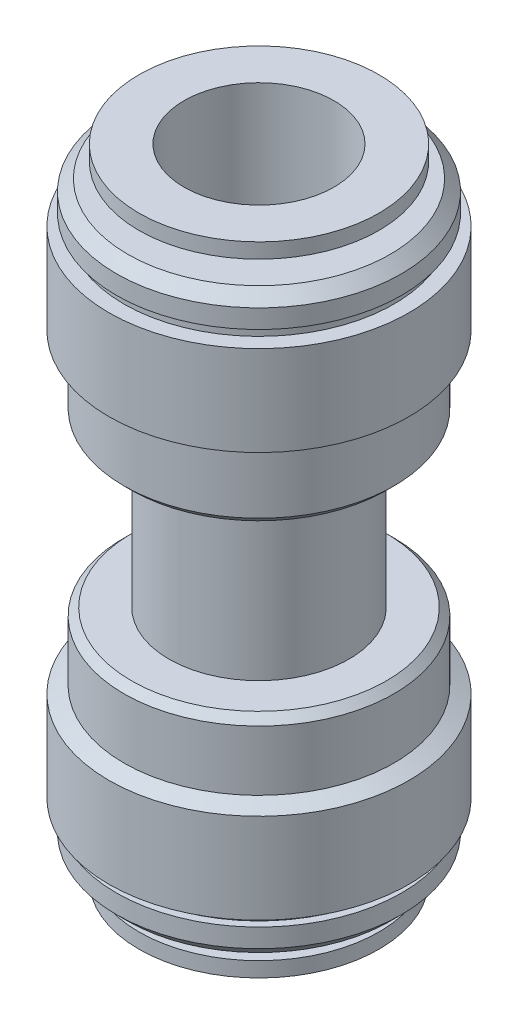
ISO-10303-21;
HEADER;
FILE_DESCRIPTION(('STEP AP214'),'2;1');
FILE_NAME('part.step','',(''),(''),'','','');
FILE_SCHEMA(('AUTOMOTIVE_DESIGN { 1 0 10303 214 1 1 1 1 }'));
ENDSEC;
DATA;
#1=APPLICATION_CONTEXT('core data for automotive mechanical design processes');
#2=APPLICATION_PROTOCOL_DEFINITION('international standard','automotive_design',2000,#1);
#3=PRODUCT_CONTEXT('',#1,'mechanical');
#4=PRODUCT('Part','Part','',(#3));
#5=PRODUCT_RELATED_PRODUCT_CATEGORY('part','',(#4));
#6=PRODUCT_DEFINITION_FORMATION('','',#4);
#7=PRODUCT_DEFINITION_CONTEXT('part definition',#1,'design');
#8=PRODUCT_DEFINITION('design','',#6,#7);
#9=PRODUCT_DEFINITION_SHAPE('','',#8);
#10=(LENGTH_UNIT() NAMED_UNIT(*) SI_UNIT(.MILLI.,.METRE.));
#11=(NAMED_UNIT(*) PLANE_ANGLE_UNIT() SI_UNIT($,.RADIAN.));
#12=(NAMED_UNIT(*) SI_UNIT($,.STERADIAN.) SOLID_ANGLE_UNIT());
#13=UNCERTAINTY_MEASURE_WITH_UNIT(LENGTH_MEASURE(1.E-05),#10,'distance_accuracy_value','');
#14=(GEOMETRIC_REPRESENTATION_CONTEXT(3) GLOBAL_UNCERTAINTY_ASSIGNED_CONTEXT((#13)) GLOBAL_UNIT_ASSIGNED_CONTEXT((#10,
#11,#12)) REPRESENTATION_CONTEXT('',''));
#15=CARTESIAN_POINT('',(0.,0.,0.));
#16=DIRECTION('',(0.,0.,1.));
#17=DIRECTION('',(1.,0.,0.));
#18=AXIS2_PLACEMENT_3D('',#15,#16,#17);
#19=CARTESIAN_POINT('',(0.,42.5,0.));
#20=DIRECTION('',(0.,-1.,0.));
#21=DIRECTION('',(0.,0.,-1.));
#22=AXIS2_PLACEMENT_3D('',#19,#20,#21);
#23=PLANE('',#22);
#24=CARTESIAN_POINT('',(0.,42.5,0.));
#25=DIRECTION('',(0.,1.,0.));
#26=DIRECTION('',(0.,0.,1.));
#27=AXIS2_PLACEMENT_3D('',#24,#25,#26);
#28=CIRCLE('',#27,5.);
#29=CARTESIAN_POINT('',(0.,42.5,5.));
#30=VERTEX_POINT('',#29);
#31=EDGE_CURVE('E129',#30,#30,#28,.T.);
#32=ORIENTED_EDGE('',*,*,#31,.F.);
#33=EDGE_LOOP('',(#32));
#34=FACE_BOUND('',#33,.T.);
#35=CARTESIAN_POINT('',(0.,42.5,0.));
#36=DIRECTION('',(0.,1.,0.));
#37=DIRECTION('',(0.,0.,1.));
#38=AXIS2_PLACEMENT_3D('',#35,#36,#37);
#39=CIRCLE('',#38,8.);
#40=CARTESIAN_POINT('',(0.,42.5,8.));
#41=VERTEX_POINT('',#40);
#42=EDGE_CURVE('E10',#41,#41,#39,.T.);
#43=ORIENTED_EDGE('',*,*,#42,.T.);
#44=EDGE_LOOP('',(#43));
#45=FACE_BOUND('',#44,.T.);
#46=ADVANCED_FACE('F32',(#34,#45),#23,.F.);
#47=CARTESIAN_POINT('',(0.,136.374036199003,0.));
#48=DIRECTION('',(0.,1.,0.));
#49=DIRECTION('',(0.,0.,1.));
#50=AXIS2_PLACEMENT_3D('',#47,#48,#49);
#51=CYLINDRICAL_SURFACE('',#50,8.);
#52=ORIENTED_EDGE('',*,*,#42,.F.);
#53=EDGE_LOOP('',(#52));
#54=FACE_BOUND('',#53,.T.);
#55=CARTESIAN_POINT('',(0.,41.5,0.));
#56=DIRECTION('',(0.,1.,0.));
#57=DIRECTION('',(0.,0.,1.));
#58=AXIS2_PLACEMENT_3D('',#55,#56,#57);
#59=CIRCLE('',#58,8.);
#60=CARTESIAN_POINT('',(0.,41.5,8.));
#61=VERTEX_POINT('',#60);
#62=EDGE_CURVE('E39',#61,#61,#59,.T.);
#63=ORIENTED_EDGE('',*,*,#62,.T.);
#64=EDGE_LOOP('',(#63));
#65=FACE_BOUND('',#64,.T.);
#66=ADVANCED_FACE('F148',(#54,#65),#51,.T.);
#67=CARTESIAN_POINT('',(8.,41.5,0.));
#68=DIRECTION('',(0.,1.,0.));
#69=DIRECTION('',(0.,0.,1.));
#70=AXIS2_PLACEMENT_3D('',#67,#68,#69);
#71=PLANE('',#70);
#72=ORIENTED_EDGE('',*,*,#62,.F.);
#73=EDGE_LOOP('',(#72));
#74=FACE_BOUND('',#73,.T.);
#75=CARTESIAN_POINT('',(0.,41.5,0.));
#76=DIRECTION('',(0.,1.,0.));
#77=DIRECTION('',(0.,0.,1.));
#78=AXIS2_PLACEMENT_3D('',#75,#76,#77);
#79=CIRCLE('',#78,6.);
#80=CARTESIAN_POINT('',(0.,41.5,6.));
#81=VERTEX_POINT('',#80);
#82=EDGE_CURVE('E43',#81,#81,#79,.T.);
#83=ORIENTED_EDGE('',*,*,#82,.T.);
#84=EDGE_LOOP('',(#83));
#85=FACE_BOUND('',#84,.T.);
#86=ADVANCED_FACE('F153',(#74,#85),#71,.F.);
#87=CARTESIAN_POINT('',(0.,136.374036199003,0.));
#88=DIRECTION('',(0.,1.,0.));
#89=DIRECTION('',(0.,0.,1.));
#90=AXIS2_PLACEMENT_3D('',#87,#88,#89);
#91=CYLINDRICAL_SURFACE('',#90,6.);
#92=ORIENTED_EDGE('',*,*,#82,.F.);
#93=EDGE_LOOP('',(#92));
#94=FACE_BOUND('',#93,.T.);
#95=CARTESIAN_POINT('',(0.,40.5,0.));
#96=DIRECTION('',(0.,1.,0.));
#97=DIRECTION('',(0.,0.,1.));
#98=AXIS2_PLACEMENT_3D('',#95,#96,#97);
#99=CIRCLE('',#98,6.);
#100=CARTESIAN_POINT('',(0.,40.5,6.));
#101=VERTEX_POINT('',#100);
#102=EDGE_CURVE('E48',#101,#101,#99,.T.);
#103=ORIENTED_EDGE('',*,*,#102,.T.);
#104=EDGE_LOOP('',(#103));
#105=FACE_BOUND('',#104,.T.);
#106=ADVANCED_FACE('F158',(#94,#105),#91,.T.);
#107=CARTESIAN_POINT('',(6.,40.5,0.));
#108=DIRECTION('',(0.,-1.,0.));
#109=DIRECTION('',(0.,0.,-1.));
#110=AXIS2_PLACEMENT_3D('',#107,#108,#109);
#111=PLANE('',#110);
#112=ORIENTED_EDGE('',*,*,#102,.F.);
#113=EDGE_LOOP('',(#112));
#114=FACE_BOUND('',#113,.T.);
#115=CARTESIAN_POINT('',(0.,40.5,0.));
#116=DIRECTION('',(0.,1.,0.));
#117=DIRECTION('',(0.,0.,1.));
#118=AXIS2_PLACEMENT_3D('',#115,#116,#117);
#119=CIRCLE('',#118,8.75000000000001);
#120=CARTESIAN_POINT('',(0.,40.5,8.75000000000001));
#121=VERTEX_POINT('',#120);
#122=EDGE_CURVE('E51',#121,#121,#119,.T.);
#123=ORIENTED_EDGE('',*,*,#122,.T.);
#124=EDGE_LOOP('',(#123));
#125=FACE_BOUND('',#124,.T.);
#126=ADVANCED_FACE('F165',(#114,#125),#111,.F.);
#127=CARTESIAN_POINT('',(0.,39.75,0.));
#128=DIRECTION('',(0.,-1.,0.));
#129=DIRECTION('',(0.,0.,-1.));
#130=AXIS2_PLACEMENT_3D('',#127,#128,#129);
#131=CONICAL_SURFACE('',#130,9.50000000000002,0.785398163397448);
#132=ORIENTED_EDGE('',*,*,#122,.F.);
#133=EDGE_LOOP('',(#132));
#134=FACE_BOUND('',#133,.T.);
#135=CARTESIAN_POINT('',(0.,39.75,0.));
#136=DIRECTION('',(0.,1.,0.));
#137=DIRECTION('',(0.,0.,1.));
#138=AXIS2_PLACEMENT_3D('',#135,#136,#137);
#139=CIRCLE('',#138,9.50000000000002);
#140=CARTESIAN_POINT('',(0.,39.75,9.50000000000002));
#141=VERTEX_POINT('',#140);
#142=EDGE_CURVE('E54',#141,#141,#139,.T.);
#143=ORIENTED_EDGE('',*,*,#142,.T.);
#144=EDGE_LOOP('',(#143));
#145=FACE_BOUND('',#144,.T.);
#146=ADVANCED_FACE('F169',(#134,#145),#131,.T.);
#147=CARTESIAN_POINT('',(0.,136.374036199003,0.));
#148=DIRECTION('',(0.,1.,0.));
#149=DIRECTION('',(0.,0.,1.));
#150=AXIS2_PLACEMENT_3D('',#147,#148,#149);
#151=CYLINDRICAL_SURFACE('',#150,9.50000000000002);
#152=ORIENTED_EDGE('',*,*,#142,.F.);
#153=EDGE_LOOP('',(#152));
#154=FACE_BOUND('',#153,.T.);
#155=CARTESIAN_POINT('',(0.,38.5,0.));
#156=DIRECTION('',(0.,1.,0.));
#157=DIRECTION('',(0.,0.,1.));
#158=AXIS2_PLACEMENT_3D('',#155,#156,#157);
#159=CIRCLE('',#158,9.50000000000002);
#160=CARTESIAN_POINT('',(0.,38.5,9.50000000000002));
#161=VERTEX_POINT('',#160);
#162=EDGE_CURVE('E57',#161,#161,#159,.T.);
#163=ORIENTED_EDGE('',*,*,#162,.T.);
#164=EDGE_LOOP('',(#163));
#165=FACE_BOUND('',#164,.T.);
#166=ADVANCED_FACE('F173',(#154,#165),#151,.T.);
#167=CARTESIAN_POINT('',(9.50000000000002,38.5,0.));
#168=DIRECTION('',(0.,1.,0.));
#169=DIRECTION('',(0.,0.,1.));
#170=AXIS2_PLACEMENT_3D('',#167,#168,#169);
#171=PLANE('',#170);
#172=ORIENTED_EDGE('',*,*,#162,.F.);
#173=EDGE_LOOP('',(#172));
#174=FACE_BOUND('',#173,.T.);
#175=CARTESIAN_POINT('',(0.,38.5,0.));
#176=DIRECTION('',(0.,1.,0.));
#177=DIRECTION('',(0.,0.,1.));
#178=AXIS2_PLACEMENT_3D('',#175,#176,#177);
#179=CIRCLE('',#178,9.00000000000001);
#180=CARTESIAN_POINT('',(0.,38.5,9.00000000000001));
#181=VERTEX_POINT('',#180);
#182=EDGE_CURVE('E60',#181,#181,#179,.T.);
#183=ORIENTED_EDGE('',*,*,#182,.T.);
#184=EDGE_LOOP('',(#183));
#185=FACE_BOUND('',#184,.T.);
#186=ADVANCED_FACE('F177',(#174,#185),#171,.F.);
#187=CARTESIAN_POINT('',(0.,136.374036199003,0.));
#188=DIRECTION('',(0.,1.,0.));
#189=DIRECTION('',(0.,0.,1.));
#190=AXIS2_PLACEMENT_3D('',#187,#188,#189);
#191=CYLINDRICAL_SURFACE('',#190,9.00000000000001);
#192=ORIENTED_EDGE('',*,*,#182,.F.);
#193=EDGE_LOOP('',(#192));
#194=FACE_BOUND('',#193,.T.);
#195=CARTESIAN_POINT('',(0.,37.75,0.));
#196=DIRECTION('',(0.,1.,0.));
#197=DIRECTION('',(0.,0.,1.));
#198=AXIS2_PLACEMENT_3D('',#195,#196,#197);
#199=CIRCLE('',#198,9.00000000000001);
#200=CARTESIAN_POINT('',(0.,37.75,9.00000000000001));
#201=VERTEX_POINT('',#200);
#202=EDGE_CURVE('E63',#201,#201,#199,.T.);
#203=ORIENTED_EDGE('',*,*,#202,.T.);
#204=EDGE_LOOP('',(#203));
#205=FACE_BOUND('',#204,.T.);
#206=ADVANCED_FACE('F181',(#194,#205),#191,.T.);
#207=CARTESIAN_POINT('',(9.00000000000001,37.75,0.));
#208=DIRECTION('',(0.,-1.,0.));
#209=DIRECTION('',(0.,0.,-1.));
#210=AXIS2_PLACEMENT_3D('',#207,#208,#209);
#211=PLANE('',#210);
#212=ORIENTED_EDGE('',*,*,#202,.F.);
#213=EDGE_LOOP('',(#212));
#214=FACE_BOUND('',#213,.T.);
#215=CARTESIAN_POINT('',(0.,37.75,0.));
#216=DIRECTION('',(0.,1.,0.));
#217=DIRECTION('',(0.,0.,1.));
#218=AXIS2_PLACEMENT_3D('',#215,#216,#217);
#219=CIRCLE('',#218,10.);
#220=CARTESIAN_POINT('',(0.,37.75,10.));
#221=VERTEX_POINT('',#220);
#222=EDGE_CURVE('E66',#221,#221,#219,.T.);
#223=ORIENTED_EDGE('',*,*,#222,.T.);
#224=EDGE_LOOP('',(#223));
#225=FACE_BOUND('',#224,.T.);
#226=ADVANCED_FACE('F185',(#214,#225),#211,.F.);
#227=CARTESIAN_POINT('',(0.,136.374036199003,0.));
#228=DIRECTION('',(0.,1.,0.));
#229=DIRECTION('',(0.,0.,1.));
#230=AXIS2_PLACEMENT_3D('',#227,#228,#229);
#231=CYLINDRICAL_SURFACE('',#230,10.);
#232=ORIENTED_EDGE('',*,*,#222,.F.);
#233=EDGE_LOOP('',(#232));
#234=FACE_BOUND('',#233,.T.);
#235=CARTESIAN_POINT('',(0.,31.75,0.));
#236=DIRECTION('',(0.,1.,0.));
#237=DIRECTION('',(0.,0.,1.));
#238=AXIS2_PLACEMENT_3D('',#235,#236,#237);
#239=CIRCLE('',#238,10.);
#240=CARTESIAN_POINT('',(0.,31.75,10.));
#241=VERTEX_POINT('',#240);
#242=EDGE_CURVE('E69',#241,#241,#239,.T.);
#243=ORIENTED_EDGE('',*,*,#242,.T.);
#244=EDGE_LOOP('',(#243));
#245=FACE_BOUND('',#244,.T.);
#246=ADVANCED_FACE('F189',(#234,#245),#231,.T.);
#247=CARTESIAN_POINT('',(0.,31.25,0.));
#248=DIRECTION('',(0.,1.,0.));
#249=DIRECTION('',(0.,0.,1.));
#250=AXIS2_PLACEMENT_3D('',#247,#248,#249);
#251=CONICAL_SURFACE('',#250,9.00000000000001,1.10714871779409);
#252=ORIENTED_EDGE('',*,*,#242,.F.);
#253=EDGE_LOOP('',(#252));
#254=FACE_BOUND('',#253,.T.);
#255=CARTESIAN_POINT('',(0.,31.25,0.));
#256=DIRECTION('',(0.,1.,0.));
#257=DIRECTION('',(0.,0.,1.));
#258=AXIS2_PLACEMENT_3D('',#255,#256,#257);
#259=CIRCLE('',#258,9.00000000000001);
#260=CARTESIAN_POINT('',(0.,31.25,9.00000000000001));
#261=VERTEX_POINT('',#260);
#262=EDGE_CURVE('E72',#261,#261,#259,.T.);
#263=ORIENTED_EDGE('',*,*,#262,.T.);
#264=EDGE_LOOP('',(#263));
#265=FACE_BOUND('',#264,.T.);
#266=ADVANCED_FACE('F193',(#254,#265),#251,.T.);
#267=CARTESIAN_POINT('',(0.,136.374036199003,0.));
#268=DIRECTION('',(0.,1.,0.));
#269=DIRECTION('',(0.,0.,1.));
#270=AXIS2_PLACEMENT_3D('',#267,#268,#269);
#271=CYLINDRICAL_SURFACE('',#270,9.00000000000001);
#272=ORIENTED_EDGE('',*,*,#262,.F.);
#273=EDGE_LOOP('',(#272));
#274=FACE_BOUND('',#273,.T.);
#275=CARTESIAN_POINT('',(0.,27.25,0.));
#276=DIRECTION('',(0.,1.,0.));
#277=DIRECTION('',(0.,0.,1.));
#278=AXIS2_PLACEMENT_3D('',#275,#276,#277);
#279=CIRCLE('',#278,9.00000000000001);
#280=CARTESIAN_POINT('',(0.,27.25,9.00000000000001));
#281=VERTEX_POINT('',#280);
#282=EDGE_CURVE('E75',#281,#281,#279,.T.);
#283=ORIENTED_EDGE('',*,*,#282,.T.);
#284=EDGE_LOOP('',(#283));
#285=FACE_BOUND('',#284,.T.);
#286=ADVANCED_FACE('F197',(#274,#285),#271,.T.);
#287=CARTESIAN_POINT('',(0.,26.75,0.));
#288=DIRECTION('',(0.,1.,0.));
#289=DIRECTION('',(0.,0.,1.));
#290=AXIS2_PLACEMENT_3D('',#287,#288,#289);
#291=CONICAL_SURFACE('',#290,8.50000000000001,0.785398163397448);
#292=ORIENTED_EDGE('',*,*,#282,.F.);
#293=EDGE_LOOP('',(#292));
#294=FACE_BOUND('',#293,.T.);
#295=CARTESIAN_POINT('',(0.,26.75,0.));
#296=DIRECTION('',(0.,1.,0.));
#297=DIRECTION('',(0.,0.,1.));
#298=AXIS2_PLACEMENT_3D('',#295,#296,#297);
#299=CIRCLE('',#298,8.50000000000001);
#300=CARTESIAN_POINT('',(0.,26.75,8.50000000000001));
#301=VERTEX_POINT('',#300);
#302=EDGE_CURVE('E78',#301,#301,#299,.T.);
#303=ORIENTED_EDGE('',*,*,#302,.T.);
#304=EDGE_LOOP('',(#303));
#305=FACE_BOUND('',#304,.T.);
#306=ADVANCED_FACE('F201',(#294,#305),#291,.T.);
#307=CARTESIAN_POINT('',(8.50000000000001,26.75,0.));
#308=DIRECTION('',(0.,1.,0.));
#309=DIRECTION('',(0.,0.,1.));
#310=AXIS2_PLACEMENT_3D('',#307,#308,#309);
#311=PLANE('',#310);
#312=ORIENTED_EDGE('',*,*,#302,.F.);
#313=EDGE_LOOP('',(#312));
#314=FACE_BOUND('',#313,.T.);
#315=CARTESIAN_POINT('',(0.,26.75,0.));
#316=DIRECTION('',(0.,1.,0.));
#317=DIRECTION('',(0.,0.,1.));
#318=AXIS2_PLACEMENT_3D('',#315,#316,#317);
#319=CIRCLE('',#318,6.00000000000002);
#320=CARTESIAN_POINT('',(0.,26.75,6.00000000000002));
#321=VERTEX_POINT('',#320);
#322=EDGE_CURVE('E81',#321,#321,#319,.T.);
#323=ORIENTED_EDGE('',*,*,#322,.T.);
#324=EDGE_LOOP('',(#323));
#325=FACE_BOUND('',#324,.T.);
#326=ADVANCED_FACE('F205',(#314,#325),#311,.F.);
#327=CARTESIAN_POINT('',(0.,136.374036199003,0.));
#328=DIRECTION('',(0.,1.,0.));
#329=DIRECTION('',(0.,0.,1.));
#330=AXIS2_PLACEMENT_3D('',#327,#328,#329);
#331=CYLINDRICAL_SURFACE('',#330,6.00000000000002);
#332=ORIENTED_EDGE('',*,*,#322,.F.);
#333=EDGE_LOOP('',(#332));
#334=FACE_BOUND('',#333,.T.);
#335=CARTESIAN_POINT('',(0.,15.75,0.));
#336=DIRECTION('',(0.,1.,0.));
#337=DIRECTION('',(0.,0.,1.));
#338=AXIS2_PLACEMENT_3D('',#335,#336,#337);
#339=CIRCLE('',#338,6.00000000000002);
#340=CARTESIAN_POINT('',(0.,15.75,6.00000000000002));
#341=VERTEX_POINT('',#340);
#342=EDGE_CURVE('E84',#341,#341,#339,.T.);
#343=ORIENTED_EDGE('',*,*,#342,.T.);
#344=EDGE_LOOP('',(#343));
#345=FACE_BOUND('',#344,.T.);
#346=ADVANCED_FACE('F209',(#334,#345),#331,.T.);
#347=CARTESIAN_POINT('',(8.50000000000001,15.75,0.));
#348=DIRECTION('',(0.,-1.,0.));
#349=DIRECTION('',(0.,0.,-1.));
#350=AXIS2_PLACEMENT_3D('',#347,#348,#349);
#351=PLANE('',#350);
#352=ORIENTED_EDGE('',*,*,#342,.F.);
#353=EDGE_LOOP('',(#352));
#354=FACE_BOUND('',#353,.T.);
#355=CARTESIAN_POINT('',(0.,15.75,0.));
#356=DIRECTION('',(0.,1.,0.));
#357=DIRECTION('',(0.,0.,1.));
#358=AXIS2_PLACEMENT_3D('',#355,#356,#357);
#359=CIRCLE('',#358,8.50000000000001);
#360=CARTESIAN_POINT('',(0.,15.75,8.50000000000001));
#361=VERTEX_POINT('',#360);
#362=EDGE_CURVE('E87',#361,#361,#359,.T.);
#363=ORIENTED_EDGE('',*,*,#362,.T.);
#364=EDGE_LOOP('',(#363));
#365=FACE_BOUND('',#364,.T.);
#366=ADVANCED_FACE('F213',(#354,#365),#351,.F.);
#367=CARTESIAN_POINT('',(0.,15.25,0.));
#368=DIRECTION('',(0.,-1.,0.));
#369=DIRECTION('',(0.,0.,-1.));
#370=AXIS2_PLACEMENT_3D('',#367,#368,#369);
#371=CONICAL_SURFACE('',#370,9.00000000000001,0.785398163397448);
#372=ORIENTED_EDGE('',*,*,#362,.F.);
#373=EDGE_LOOP('',(#372));
#374=FACE_BOUND('',#373,.T.);
#375=CARTESIAN_POINT('',(0.,15.25,0.));
#376=DIRECTION('',(0.,1.,0.));
#377=DIRECTION('',(0.,0.,1.));
#378=AXIS2_PLACEMENT_3D('',#375,#376,#377);
#379=CIRCLE('',#378,9.00000000000001);
#380=CARTESIAN_POINT('',(0.,15.25,9.00000000000001));
#381=VERTEX_POINT('',#380);
#382=EDGE_CURVE('E90',#381,#381,#379,.T.);
#383=ORIENTED_EDGE('',*,*,#382,.T.);
#384=EDGE_LOOP('',(#383));
#385=FACE_BOUND('',#384,.T.);
#386=ADVANCED_FACE('F217',(#374,#385),#371,.T.);
#387=CARTESIAN_POINT('',(0.,136.374036199003,0.));
#388=DIRECTION('',(0.,1.,0.));
#389=DIRECTION('',(0.,0.,1.));
#390=AXIS2_PLACEMENT_3D('',#387,#388,#389);
#391=CYLINDRICAL_SURFACE('',#390,9.00000000000001);
#392=ORIENTED_EDGE('',*,*,#382,.F.);
#393=EDGE_LOOP('',(#392));
#394=FACE_BOUND('',#393,.T.);
#395=CARTESIAN_POINT('',(0.,11.25,0.));
#396=DIRECTION('',(0.,1.,0.));
#397=DIRECTION('',(0.,0.,1.));
#398=AXIS2_PLACEMENT_3D('',#395,#396,#397);
#399=CIRCLE('',#398,9.00000000000001);
#400=CARTESIAN_POINT('',(0.,11.25,9.00000000000001));
#401=VERTEX_POINT('',#400);
#402=EDGE_CURVE('E93',#401,#401,#399,.T.);
#403=ORIENTED_EDGE('',*,*,#402,.T.);
#404=EDGE_LOOP('',(#403));
#405=FACE_BOUND('',#404,.T.);
#406=ADVANCED_FACE('F221',(#394,#405),#391,.T.);
#407=CARTESIAN_POINT('',(0.,10.75,0.));
#408=DIRECTION('',(0.,-1.,0.));
#409=DIRECTION('',(0.,0.,-1.));
#410=AXIS2_PLACEMENT_3D('',#407,#408,#409);
#411=CONICAL_SURFACE('',#410,10.,1.10714871779409);
#412=ORIENTED_EDGE('',*,*,#402,.F.);
#413=EDGE_LOOP('',(#412));
#414=FACE_BOUND('',#413,.T.);
#415=CARTESIAN_POINT('',(0.,10.75,0.));
#416=DIRECTION('',(0.,1.,0.));
#417=DIRECTION('',(0.,0.,1.));
#418=AXIS2_PLACEMENT_3D('',#415,#416,#417);
#419=CIRCLE('',#418,10.);
#420=CARTESIAN_POINT('',(0.,10.75,10.));
#421=VERTEX_POINT('',#420);
#422=EDGE_CURVE('E96',#421,#421,#419,.T.);
#423=ORIENTED_EDGE('',*,*,#422,.T.);
#424=EDGE_LOOP('',(#423));
#425=FACE_BOUND('',#424,.T.);
#426=ADVANCED_FACE('F225',(#414,#425),#411,.T.);
#427=CARTESIAN_POINT('',(0.,136.374036199003,0.));
#428=DIRECTION('',(0.,1.,0.));
#429=DIRECTION('',(0.,0.,1.));
#430=AXIS2_PLACEMENT_3D('',#427,#428,#429);
#431=CYLINDRICAL_SURFACE('',#430,10.);
#432=ORIENTED_EDGE('',*,*,#422,.F.);
#433=EDGE_LOOP('',(#432));
#434=FACE_BOUND('',#433,.T.);
#435=CARTESIAN_POINT('',(0.,4.75,0.));
#436=DIRECTION('',(0.,1.,0.));
#437=DIRECTION('',(0.,0.,1.));
#438=AXIS2_PLACEMENT_3D('',#435,#436,#437);
#439=CIRCLE('',#438,10.);
#440=CARTESIAN_POINT('',(0.,4.75,10.));
#441=VERTEX_POINT('',#440);
#442=EDGE_CURVE('E99',#441,#441,#439,.T.);
#443=ORIENTED_EDGE('',*,*,#442,.T.);
#444=EDGE_LOOP('',(#443));
#445=FACE_BOUND('',#444,.T.);
#446=ADVANCED_FACE('F229',(#434,#445),#431,.T.);
#447=CARTESIAN_POINT('',(9.00000000000001,4.75,0.));
#448=DIRECTION('',(0.,1.,0.));
#449=DIRECTION('',(0.,0.,1.));
#450=AXIS2_PLACEMENT_3D('',#447,#448,#449);
#451=PLANE('',#450);
#452=ORIENTED_EDGE('',*,*,#442,.F.);
#453=EDGE_LOOP('',(#452));
#454=FACE_BOUND('',#453,.T.);
#455=CARTESIAN_POINT('',(0.,4.75,0.));
#456=DIRECTION('',(0.,1.,0.));
#457=DIRECTION('',(0.,0.,1.));
#458=AXIS2_PLACEMENT_3D('',#455,#456,#457);
#459=CIRCLE('',#458,9.00000000000001);
#460=CARTESIAN_POINT('',(0.,4.75,9.00000000000001));
#461=VERTEX_POINT('',#460);
#462=EDGE_CURVE('E102',#461,#461,#459,.T.);
#463=ORIENTED_EDGE('',*,*,#462,.T.);
#464=EDGE_LOOP('',(#463));
#465=FACE_BOUND('',#464,.T.);
#466=ADVANCED_FACE('F233',(#454,#465),#451,.F.);
#467=CARTESIAN_POINT('',(0.,136.374036199003,0.));
#468=DIRECTION('',(0.,1.,0.));
#469=DIRECTION('',(0.,0.,1.));
#470=AXIS2_PLACEMENT_3D('',#467,#468,#469);
#471=CYLINDRICAL_SURFACE('',#470,9.00000000000001);
#472=ORIENTED_EDGE('',*,*,#462,.F.);
#473=EDGE_LOOP('',(#472));
#474=FACE_BOUND('',#473,.T.);
#475=CARTESIAN_POINT('',(0.,4.,0.));
#476=DIRECTION('',(0.,1.,0.));
#477=DIRECTION('',(0.,0.,1.));
#478=AXIS2_PLACEMENT_3D('',#475,#476,#477);
#479=CIRCLE('',#478,9.00000000000001);
#480=CARTESIAN_POINT('',(0.,4.,9.00000000000001));
#481=VERTEX_POINT('',#480);
#482=EDGE_CURVE('E105',#481,#481,#479,.T.);
#483=ORIENTED_EDGE('',*,*,#482,.T.);
#484=EDGE_LOOP('',(#483));
#485=FACE_BOUND('',#484,.T.);
#486=ADVANCED_FACE('F237',(#474,#485),#471,.T.);
#487=CARTESIAN_POINT('',(9.50000000000002,4.,0.));
#488=DIRECTION('',(0.,-1.,0.));
#489=DIRECTION('',(0.,0.,-1.));
#490=AXIS2_PLACEMENT_3D('',#487,#488,#489);
#491=PLANE('',#490);
#492=ORIENTED_EDGE('',*,*,#482,.F.);
#493=EDGE_LOOP('',(#492));
#494=FACE_BOUND('',#493,.T.);
#495=CARTESIAN_POINT('',(0.,4.,0.));
#496=DIRECTION('',(0.,1.,0.));
#497=DIRECTION('',(0.,0.,1.));
#498=AXIS2_PLACEMENT_3D('',#495,#496,#497);
#499=CIRCLE('',#498,9.50000000000002);
#500=CARTESIAN_POINT('',(0.,4.,9.50000000000002));
#501=VERTEX_POINT('',#500);
#502=EDGE_CURVE('E108',#501,#501,#499,.T.);
#503=ORIENTED_EDGE('',*,*,#502,.T.);
#504=EDGE_LOOP('',(#503));
#505=FACE_BOUND('',#504,.T.);
#506=ADVANCED_FACE('F241',(#494,#505),#491,.F.);
#507=CARTESIAN_POINT('',(0.,136.374036199003,0.));
#508=DIRECTION('',(0.,1.,0.));
#509=DIRECTION('',(0.,0.,1.));
#510=AXIS2_PLACEMENT_3D('',#507,#508,#509);
#511=CYLINDRICAL_SURFACE('',#510,9.50000000000002);
#512=ORIENTED_EDGE('',*,*,#502,.F.);
#513=EDGE_LOOP('',(#512));
#514=FACE_BOUND('',#513,.T.);
#515=CARTESIAN_POINT('',(0.,2.75,0.));
#516=DIRECTION('',(0.,1.,0.));
#517=DIRECTION('',(0.,0.,1.));
#518=AXIS2_PLACEMENT_3D('',#515,#516,#517);
#519=CIRCLE('',#518,9.50000000000002);
#520=CARTESIAN_POINT('',(0.,2.75,9.50000000000002));
#521=VERTEX_POINT('',#520);
#522=EDGE_CURVE('E111',#521,#521,#519,.T.);
#523=ORIENTED_EDGE('',*,*,#522,.T.);
#524=EDGE_LOOP('',(#523));
#525=FACE_BOUND('',#524,.T.);
#526=ADVANCED_FACE('F245',(#514,#525),#511,.T.);
#527=CARTESIAN_POINT('',(0.,2.,0.));
#528=DIRECTION('',(0.,1.,0.));
#529=DIRECTION('',(0.,0.,1.));
#530=AXIS2_PLACEMENT_3D('',#527,#528,#529);
#531=CONICAL_SURFACE('',#530,8.75000000000001,0.785398163397448);
#532=ORIENTED_EDGE('',*,*,#522,.F.);
#533=EDGE_LOOP('',(#532));
#534=FACE_BOUND('',#533,.T.);
#535=CARTESIAN_POINT('',(0.,2.,0.));
#536=DIRECTION('',(0.,1.,0.));
#537=DIRECTION('',(0.,0.,1.));
#538=AXIS2_PLACEMENT_3D('',#535,#536,#537);
#539=CIRCLE('',#538,8.75000000000001);
#540=CARTESIAN_POINT('',(0.,2.,8.75000000000001));
#541=VERTEX_POINT('',#540);
#542=EDGE_CURVE('E114',#541,#541,#539,.T.);
#543=ORIENTED_EDGE('',*,*,#542,.T.);
#544=EDGE_LOOP('',(#543));
#545=FACE_BOUND('',#544,.T.);
#546=ADVANCED_FACE('F249',(#534,#545),#531,.T.);
#547=CARTESIAN_POINT('',(6.,2.,0.));
#548=DIRECTION('',(0.,1.,0.));
#549=DIRECTION('',(0.,0.,1.));
#550=AXIS2_PLACEMENT_3D('',#547,#548,#549);
#551=PLANE('',#550);
#552=ORIENTED_EDGE('',*,*,#542,.F.);
#553=EDGE_LOOP('',(#552));
#554=FACE_BOUND('',#553,.T.);
#555=CARTESIAN_POINT('',(0.,2.,0.));
#556=DIRECTION('',(0.,1.,0.));
#557=DIRECTION('',(0.,0.,1.));
#558=AXIS2_PLACEMENT_3D('',#555,#556,#557);
#559=CIRCLE('',#558,6.);
#560=CARTESIAN_POINT('',(0.,2.,6.));
#561=VERTEX_POINT('',#560);
#562=EDGE_CURVE('E117',#561,#561,#559,.T.);
#563=ORIENTED_EDGE('',*,*,#562,.T.);
#564=EDGE_LOOP('',(#563));
#565=FACE_BOUND('',#564,.T.);
#566=ADVANCED_FACE('F253',(#554,#565),#551,.F.);
#567=CARTESIAN_POINT('',(0.,136.374036199003,0.));
#568=DIRECTION('',(0.,1.,0.));
#569=DIRECTION('',(0.,0.,1.));
#570=AXIS2_PLACEMENT_3D('',#567,#568,#569);
#571=CYLINDRICAL_SURFACE('',#570,6.);
#572=ORIENTED_EDGE('',*,*,#562,.F.);
#573=EDGE_LOOP('',(#572));
#574=FACE_BOUND('',#573,.T.);
#575=CARTESIAN_POINT('',(0.,1.,0.));
#576=DIRECTION('',(0.,1.,0.));
#577=DIRECTION('',(0.,0.,1.));
#578=AXIS2_PLACEMENT_3D('',#575,#576,#577);
#579=CIRCLE('',#578,6.);
#580=CARTESIAN_POINT('',(0.,1.,6.));
#581=VERTEX_POINT('',#580);
#582=EDGE_CURVE('E120',#581,#581,#579,.T.);
#583=ORIENTED_EDGE('',*,*,#582,.T.);
#584=EDGE_LOOP('',(#583));
#585=FACE_BOUND('',#584,.T.);
#586=ADVANCED_FACE('F257',(#574,#585),#571,.T.);
#587=CARTESIAN_POINT('',(8.,1.,0.));
#588=DIRECTION('',(0.,-1.,0.));
#589=DIRECTION('',(0.,0.,-1.));
#590=AXIS2_PLACEMENT_3D('',#587,#588,#589);
#591=PLANE('',#590);
#592=ORIENTED_EDGE('',*,*,#582,.F.);
#593=EDGE_LOOP('',(#592));
#594=FACE_BOUND('',#593,.T.);
#595=CARTESIAN_POINT('',(0.,1.,0.));
#596=DIRECTION('',(0.,1.,0.));
#597=DIRECTION('',(0.,0.,1.));
#598=AXIS2_PLACEMENT_3D('',#595,#596,#597);
#599=CIRCLE('',#598,8.);
#600=CARTESIAN_POINT('',(0.,1.,8.));
#601=VERTEX_POINT('',#600);
#602=EDGE_CURVE('E123',#601,#601,#599,.T.);
#603=ORIENTED_EDGE('',*,*,#602,.T.);
#604=EDGE_LOOP('',(#603));
#605=FACE_BOUND('',#604,.T.);
#606=ADVANCED_FACE('F261',(#594,#605),#591,.F.);
#607=CARTESIAN_POINT('',(0.,136.374036199003,0.));
#608=DIRECTION('',(0.,1.,0.));
#609=DIRECTION('',(0.,0.,1.));
#610=AXIS2_PLACEMENT_3D('',#607,#608,#609);
#611=CYLINDRICAL_SURFACE('',#610,8.);
#612=ORIENTED_EDGE('',*,*,#602,.F.);
#613=EDGE_LOOP('',(#612));
#614=FACE_BOUND('',#613,.T.);
#615=CARTESIAN_POINT('',(0.,0.,0.));
#616=DIRECTION('',(0.,1.,0.));
#617=DIRECTION('',(0.,0.,1.));
#618=AXIS2_PLACEMENT_3D('',#615,#616,#617);
#619=CIRCLE('',#618,8.);
#620=CARTESIAN_POINT('',(0.,0.,8.));
#621=VERTEX_POINT('',#620);
#622=EDGE_CURVE('E126',#621,#621,#619,.T.);
#623=ORIENTED_EDGE('',*,*,#622,.T.);
#624=EDGE_LOOP('',(#623));
#625=FACE_BOUND('',#624,.T.);
#626=ADVANCED_FACE('F145',(#614,#625),#611,.T.);
#627=CARTESIAN_POINT('',(0.,0.,0.));
#628=DIRECTION('',(0.,1.,0.));
#629=DIRECTION('',(0.,0.,1.));
#630=AXIS2_PLACEMENT_3D('',#627,#628,#629);
#631=PLANE('',#630);
#632=CARTESIAN_POINT('',(0.,0.,0.));
#633=DIRECTION('',(0.,1.,0.));
#634=DIRECTION('',(0.,0.,1.));
#635=AXIS2_PLACEMENT_3D('',#632,#633,#634);
#636=CIRCLE('',#635,5.);
#637=CARTESIAN_POINT('',(0.,0.,5.));
#638=VERTEX_POINT('',#637);
#639=EDGE_CURVE('E35',#638,#638,#636,.T.);
#640=ORIENTED_EDGE('',*,*,#639,.T.);
#641=EDGE_LOOP('',(#640));
#642=FACE_BOUND('',#641,.T.);
#643=ORIENTED_EDGE('',*,*,#622,.F.);
#644=EDGE_LOOP('',(#643));
#645=FACE_BOUND('',#644,.T.);
#646=ADVANCED_FACE('F136',(#642,#645),#631,.F.);
#647=CARTESIAN_POINT('',(0.,-17.5,0.));
#648=DIRECTION('',(0.,1.,0.));
#649=DIRECTION('',(0.,0.,1.));
#650=AXIS2_PLACEMENT_3D('',#647,#648,#649);
#651=CYLINDRICAL_SURFACE('',#650,5.);
#652=CARTESIAN_POINT('',(0.,42.5,5.));
#653=CARTESIAN_POINT('',(0.,42.0572916666667,5.));
#654=CARTESIAN_POINT('',(0.,41.6145833333333,5.));
#655=CARTESIAN_POINT('',(0.,40.7291666666667,5.));
#656=CARTESIAN_POINT('',(0.,40.2864583333333,5.));
#657=CARTESIAN_POINT('',(0.,39.4010416666667,5.));
#658=CARTESIAN_POINT('',(0.,38.9583333333333,5.));
#659=CARTESIAN_POINT('',(0.,38.0729166666667,5.));
#660=CARTESIAN_POINT('',(0.,37.6302083333333,5.));
#661=CARTESIAN_POINT('',(0.,36.7447916666667,5.));
#662=CARTESIAN_POINT('',(0.,36.3020833333333,5.));
#663=CARTESIAN_POINT('',(0.,35.4166666666667,5.));
#664=CARTESIAN_POINT('',(0.,34.9739583333333,5.));
#665=CARTESIAN_POINT('',(0.,34.0885416666667,5.));
#666=CARTESIAN_POINT('',(0.,33.6458333333333,5.));
#667=CARTESIAN_POINT('',(0.,32.7604166666667,5.));
#668=CARTESIAN_POINT('',(0.,32.3177083333333,5.));
#669=CARTESIAN_POINT('',(0.,31.4322916666667,5.));
#670=CARTESIAN_POINT('',(0.,30.9895833333333,5.));
#671=CARTESIAN_POINT('',(0.,30.1041666666667,5.));
#672=CARTESIAN_POINT('',(0.,29.6614583333333,5.));
#673=CARTESIAN_POINT('',(0.,28.7760416666667,5.));
#674=CARTESIAN_POINT('',(0.,28.3333333333333,5.));
#675=CARTESIAN_POINT('',(0.,27.4479166666667,5.));
#676=CARTESIAN_POINT('',(0.,27.0052083333333,5.));
#677=CARTESIAN_POINT('',(0.,26.1197916666667,5.));
#678=CARTESIAN_POINT('',(0.,25.6770833333333,5.));
#679=CARTESIAN_POINT('',(0.,24.7916666666667,5.));
#680=CARTESIAN_POINT('',(0.,24.3489583333333,5.));
#681=CARTESIAN_POINT('',(0.,23.4635416666667,5.));
#682=CARTESIAN_POINT('',(0.,23.0208333333333,5.));
#683=CARTESIAN_POINT('',(0.,22.1354166666667,5.));
#684=CARTESIAN_POINT('',(0.,21.6927083333333,5.));
#685=CARTESIAN_POINT('',(0.,20.8072916666667,5.));
#686=CARTESIAN_POINT('',(0.,20.3645833333333,5.));
#687=CARTESIAN_POINT('',(0.,19.4791666666667,5.));
#688=CARTESIAN_POINT('',(0.,19.0364583333333,5.));
#689=CARTESIAN_POINT('',(0.,18.1510416666667,5.));
#690=CARTESIAN_POINT('',(0.,17.7083333333333,5.));
#691=CARTESIAN_POINT('',(0.,16.8229166666667,5.));
#692=CARTESIAN_POINT('',(0.,16.3802083333333,5.));
#693=CARTESIAN_POINT('',(0.,15.4947916666667,5.));
#694=CARTESIAN_POINT('',(0.,15.0520833333333,5.));
#695=CARTESIAN_POINT('',(0.,14.1666666666667,5.));
#696=CARTESIAN_POINT('',(0.,13.7239583333333,5.));
#697=CARTESIAN_POINT('',(0.,12.8385416666667,5.));
#698=CARTESIAN_POINT('',(0.,12.3958333333333,5.));
#699=CARTESIAN_POINT('',(0.,11.5104166666667,5.));
#700=CARTESIAN_POINT('',(0.,11.0677083333333,5.));
#701=CARTESIAN_POINT('',(0.,10.1822916666667,5.));
#702=CARTESIAN_POINT('',(0.,9.73958333333333,5.));
#703=CARTESIAN_POINT('',(0.,8.85416666666667,5.));
#704=CARTESIAN_POINT('',(0.,8.41145833333333,5.));
#705=CARTESIAN_POINT('',(0.,7.52604166666666,5.));
#706=CARTESIAN_POINT('',(0.,7.08333333333333,5.));
#707=CARTESIAN_POINT('',(0.,6.19791666666666,5.));
#708=CARTESIAN_POINT('',(0.,5.75520833333333,5.));
#709=CARTESIAN_POINT('',(0.,4.86979166666666,5.));
#710=CARTESIAN_POINT('',(0.,4.42708333333333,5.));
#711=CARTESIAN_POINT('',(0.,3.54166666666666,5.));
#712=CARTESIAN_POINT('',(0.,3.09895833333333,5.));
#713=CARTESIAN_POINT('',(0.,2.21354166666666,5.));
#714=CARTESIAN_POINT('',(0.,1.77083333333333,5.));
#715=CARTESIAN_POINT('',(0.,0.885416666666663,5.));
#716=CARTESIAN_POINT('',(0.,0.44270833333333,5.));
#717=CARTESIAN_POINT('',(0.,0.,5.));
#718=B_SPLINE_CURVE_WITH_KNOTS('',3,(#652,#653,#654,#655,#656,#657,#658,#659,#660,#661,#662,
#663,#664,#665,#666,#667,#668,#669,#670,#671,#672,#673,#674,#675,#676,#677,#678,#679,#680,#681,
#682,#683,#684,#685,#686,#687,#688,#689,#690,#691,#692,#693,#694,#695,#696,#697,#698,#699,#700,
#701,#702,#703,#704,#705,#706,#707,#708,#709,#710,#711,#712,#713,#714,#715,#716,#717),
.UNSPECIFIED.,.F.,.F.,(4,2,2,2,2,2,2,2,2,2,2,2,2,2,2,2,2,2,2,2,2,2,2,2,2,2,2,2,2,2,2,2,4),(0.,
1.328125,2.65625,3.984375,5.3125,6.640625,7.96875,9.296875,10.625,11.953125,13.28125,14.609375,
15.9375,17.265625,18.59375,19.921875,21.25,22.578125,23.90625,25.234375,26.5625,27.890625,
29.21875,30.546875,31.875,33.203125,34.53125,35.859375,37.1875,38.515625,39.84375,41.171875,
42.5),.UNSPECIFIED.);
#719=EDGE_CURVE('BSEAM139',#30,#638,#718,.T.);
#720=ORIENTED_EDGE('',*,*,#31,.T.);
#721=ORIENTED_EDGE('',*,*,#639,.F.);
#722=ORIENTED_EDGE('',*,*,#719,.T.);
#723=ORIENTED_EDGE('',*,*,#719,.F.);
#724=EDGE_LOOP('',(#720,#722,#721,#723));
#725=FACE_BOUND('',#724,.T.);
#726=ADVANCED_FACE('F139',(#725),#651,.F.);
#727=CLOSED_SHELL('',(#46,#66,#86,#106,#126,#146,#166,#186,#206,#226,#246,#266,#286,#306,#326,
#346,#366,#386,#406,#426,#446,#466,#486,#506,#526,#546,#566,#586,#606,#626,#646,#726));
#728=MANIFOLD_SOLID_BREP('B2',#727);
#729=ADVANCED_BREP_SHAPE_REPRESENTATION('',(#18,#728),#14);
#730=SHAPE_DEFINITION_REPRESENTATION(#9,#729);
ENDSEC;
END-ISO-10303-21;
